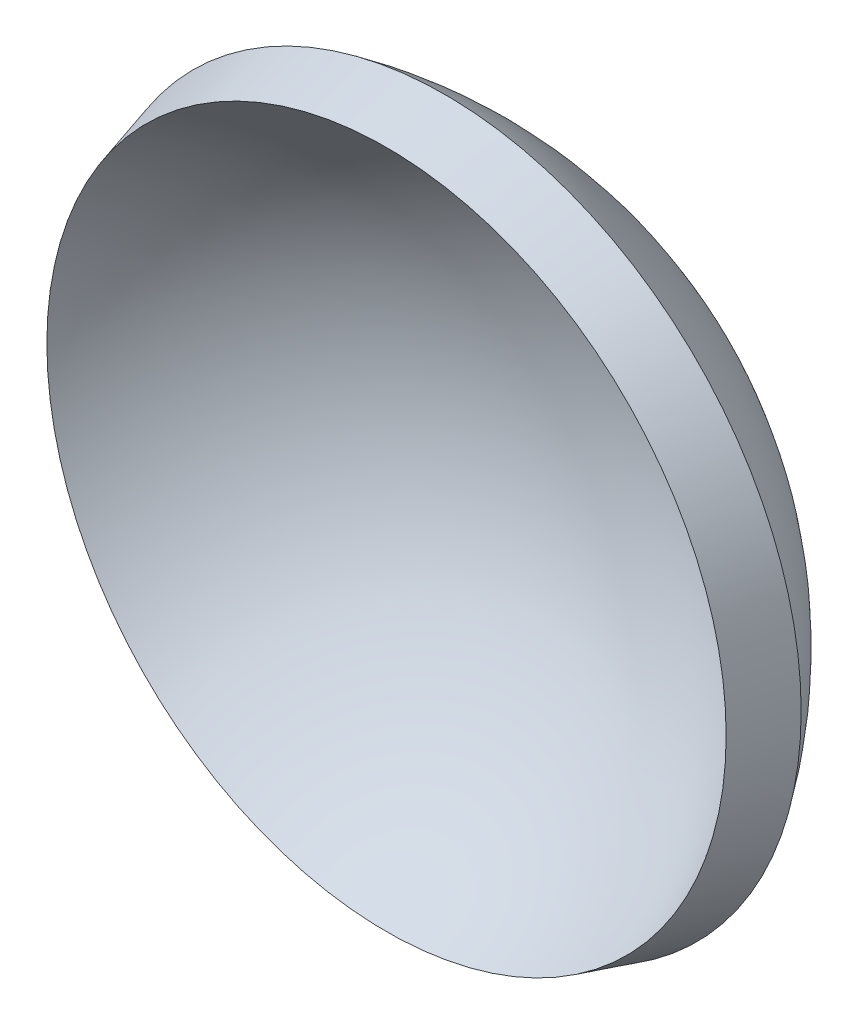
ISO-10303-21;
HEADER;
FILE_DESCRIPTION(('STEP AP214'),'2;1');
FILE_NAME('part.step','',(''),(''),'','','');
FILE_SCHEMA(('AUTOMOTIVE_DESIGN { 1 0 10303 214 1 1 1 1 }'));
ENDSEC;
DATA;
#1=APPLICATION_CONTEXT('core data for automotive mechanical design processes');
#2=APPLICATION_PROTOCOL_DEFINITION('international standard','automotive_design',2000,#1);
#3=PRODUCT_CONTEXT('',#1,'mechanical');
#4=PRODUCT('Part','Part','',(#3));
#5=PRODUCT_RELATED_PRODUCT_CATEGORY('part','',(#4));
#6=PRODUCT_DEFINITION_FORMATION('','',#4);
#7=PRODUCT_DEFINITION_CONTEXT('part definition',#1,'design');
#8=PRODUCT_DEFINITION('design','',#6,#7);
#9=PRODUCT_DEFINITION_SHAPE('','',#8);
#10=(LENGTH_UNIT() NAMED_UNIT(*) SI_UNIT(.MILLI.,.METRE.));
#11=(NAMED_UNIT(*) PLANE_ANGLE_UNIT() SI_UNIT($,.RADIAN.));
#12=(NAMED_UNIT(*) SI_UNIT($,.STERADIAN.) SOLID_ANGLE_UNIT());
#13=UNCERTAINTY_MEASURE_WITH_UNIT(LENGTH_MEASURE(1.E-05),#10,'distance_accuracy_value','');
#14=(GEOMETRIC_REPRESENTATION_CONTEXT(3) GLOBAL_UNCERTAINTY_ASSIGNED_CONTEXT((#13)) GLOBAL_UNIT_ASSIGNED_CONTEXT((#10,
#11,#12)) REPRESENTATION_CONTEXT('',''));
#15=CARTESIAN_POINT('',(0.,0.,0.));
#16=DIRECTION('',(0.,0.,1.));
#17=DIRECTION('',(1.,0.,0.));
#18=AXIS2_PLACEMENT_3D('',#15,#16,#17);
#19=CARTESIAN_POINT('',(0.,0.,33.0918443728319));
#20=DIRECTION('',(0.,0.,1.));
#21=DIRECTION('',(1.,0.,0.));
#22=AXIS2_PLACEMENT_3D('',#19,#20,#21);
#23=SPHERICAL_SURFACE('',#22,8.69);
#24=CARTESIAN_POINT('',(0.,0.,28.1601027940385));
#25=DIRECTION('',(0.,0.,1.));
#26=DIRECTION('',(1.,0.,0.));
#27=AXIS2_PLACEMENT_3D('',#24,#25,#26);
#28=CIRCLE('',#27,7.155);
#29=CARTESIAN_POINT('',(7.155,0.,28.1601027940385));
#30=VERTEX_POINT('',#29);
#31=EDGE_CURVE('E10',#30,#30,#28,.T.);
#32=ORIENTED_EDGE('',*,*,#31,.F.);
#33=EDGE_LOOP('',(#32));
#34=FACE_BOUND('',#33,.T.);
#35=ADVANCED_FACE('F43',(#34),#23,.T.);
#36=CARTESIAN_POINT('',(0.,0.,29.3363661111412));
#37=DIRECTION('',(0.,0.,-1.));
#38=DIRECTION('',(-1.,0.,0.));
#39=AXIS2_PLACEMENT_3D('',#36,#37,#38);
#40=CONICAL_SURFACE('',#39,6.8242380301167,0.274118535548069);
#41=ORIENTED_EDGE('',*,*,#31,.T.);
#42=EDGE_LOOP('',(#41));
#43=FACE_BOUND('',#42,.T.);
#44=CARTESIAN_POINT('',(0.,0.,29.3363661111412));
#45=DIRECTION('',(0.,0.,1.));
#46=DIRECTION('',(1.,0.,0.));
#47=AXIS2_PLACEMENT_3D('',#44,#45,#46);
#48=CIRCLE('',#47,6.8242380301167);
#49=CARTESIAN_POINT('',(6.8242380301167,0.,29.3363661111412));
#50=VERTEX_POINT('',#49);
#51=EDGE_CURVE('E50',#50,#50,#48,.T.);
#52=ORIENTED_EDGE('',*,*,#51,.F.);
#53=EDGE_LOOP('',(#52));
#54=FACE_BOUND('',#53,.T.);
#55=ADVANCED_FACE('F59',(#43,#54),#40,.T.);
#56=CARTESIAN_POINT('',(0.,0.,33.0521037628319));
#57=DIRECTION('',(0.,0.,1.));
#58=DIRECTION('',(-1.,0.,0.));
#59=AXIS2_PLACEMENT_3D('',#56,#57,#58);
#60=SPHERICAL_SURFACE('',#59,7.77025939);
#61=ORIENTED_EDGE('',*,*,#51,.T.);
#62=EDGE_LOOP('',(#61));
#63=FACE_BOUND('',#62,.T.);
#64=ADVANCED_FACE('F57',(#63),#60,.F.);
#65=CLOSED_SHELL('',(#35,#55,#64));
#66=MANIFOLD_SOLID_BREP('B2',#65);
#67=ADVANCED_BREP_SHAPE_REPRESENTATION('',(#18,#66),#14);
#68=SHAPE_DEFINITION_REPRESENTATION(#9,#67);
ENDSEC;
END-ISO-10303-21;
